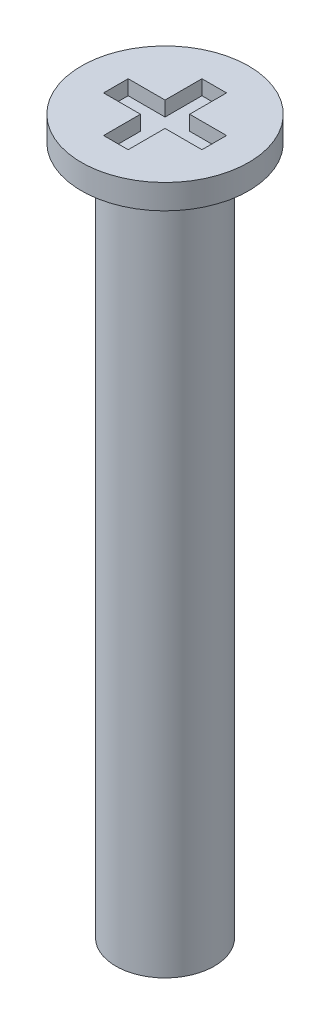
ISO-10303-21;
HEADER;
FILE_DESCRIPTION(('STEP AP214'),'2;1');
FILE_NAME('part.step','',(''),(''),'','','');
FILE_SCHEMA(('AUTOMOTIVE_DESIGN { 1 0 10303 214 1 1 1 1 }'));
ENDSEC;
DATA;
#1=APPLICATION_CONTEXT('core data for automotive mechanical design processes');
#2=APPLICATION_PROTOCOL_DEFINITION('international standard','automotive_design',2000,#1);
#3=PRODUCT_CONTEXT('',#1,'mechanical');
#4=PRODUCT('Part','Part','',(#3));
#5=PRODUCT_RELATED_PRODUCT_CATEGORY('part','',(#4));
#6=PRODUCT_DEFINITION_FORMATION('','',#4);
#7=PRODUCT_DEFINITION_CONTEXT('part definition',#1,'design');
#8=PRODUCT_DEFINITION('design','',#6,#7);
#9=PRODUCT_DEFINITION_SHAPE('','',#8);
#10=(LENGTH_UNIT() NAMED_UNIT(*) SI_UNIT(.MILLI.,.METRE.));
#11=(NAMED_UNIT(*) PLANE_ANGLE_UNIT() SI_UNIT($,.RADIAN.));
#12=(NAMED_UNIT(*) SI_UNIT($,.STERADIAN.) SOLID_ANGLE_UNIT());
#13=UNCERTAINTY_MEASURE_WITH_UNIT(LENGTH_MEASURE(1.E-05),#10,'distance_accuracy_value','');
#14=(GEOMETRIC_REPRESENTATION_CONTEXT(3) GLOBAL_UNCERTAINTY_ASSIGNED_CONTEXT((#13)) GLOBAL_UNIT_ASSIGNED_CONTEXT((#10,
#11,#12)) REPRESENTATION_CONTEXT('',''));
#15=CARTESIAN_POINT('',(0.,0.,0.));
#16=DIRECTION('',(0.,0.,1.));
#17=DIRECTION('',(1.,0.,0.));
#18=AXIS2_PLACEMENT_3D('',#15,#16,#17);
#19=CARTESIAN_POINT('',(0.,0.,0.));
#20=DIRECTION('',(0.,1.,0.));
#21=DIRECTION('',(0.,0.,1.));
#22=AXIS2_PLACEMENT_3D('',#19,#20,#21);
#23=PLANE('',#22);
#24=DIRECTION('',(-1.,0.,0.));
#25=VECTOR('',#24,1.);
#26=CARTESIAN_POINT('',(0.,0.,-0.25));
#27=LINE('',#26,#25);
#28=CARTESIAN_POINT('',(1.,0.,-0.249999999999997));
#29=VERTEX_POINT('',#28);
#30=CARTESIAN_POINT('',(0.25,0.,-0.249999999999999));
#31=VERTEX_POINT('',#30);
#32=EDGE_CURVE('E190',#29,#31,#27,.T.);
#33=ORIENTED_EDGE('',*,*,#32,.F.);
#34=DIRECTION('',(0.,0.,-1.));
#35=VECTOR('',#34,1.);
#36=CARTESIAN_POINT('',(1.,0.,-0.249999999999997));
#37=LINE('',#36,#35);
#38=CARTESIAN_POINT('',(0.999999999999999,0.,0.250000000000003));
#39=VERTEX_POINT('',#38);
#40=EDGE_CURVE('E136',#39,#29,#37,.T.);
#41=ORIENTED_EDGE('',*,*,#40,.F.);
#42=DIRECTION('',(1.,0.,0.));
#43=VECTOR('',#42,1.);
#44=CARTESIAN_POINT('',(0.,0.,0.25));
#45=LINE('',#44,#43);
#46=CARTESIAN_POINT('',(0.25,0.,0.250000000000003));
#47=VERTEX_POINT('',#46);
#48=EDGE_CURVE('E192',#47,#39,#45,.T.);
#49=ORIENTED_EDGE('',*,*,#48,.F.);
#50=DIRECTION('',(0.,0.,-1.));
#51=VECTOR('',#50,1.);
#52=CARTESIAN_POINT('',(0.25,0.,0.));
#53=LINE('',#52,#51);
#54=CARTESIAN_POINT('',(0.25,0.,1.));
#55=VERTEX_POINT('',#54);
#56=EDGE_CURVE('E162',#55,#47,#53,.T.);
#57=ORIENTED_EDGE('',*,*,#56,.F.);
#58=DIRECTION('',(1.,0.,0.));
#59=VECTOR('',#58,1.);
#60=CARTESIAN_POINT('',(0.25,0.,1.));
#61=LINE('',#60,#59);
#62=CARTESIAN_POINT('',(-0.25,0.,1.));
#63=VERTEX_POINT('',#62);
#64=EDGE_CURVE('E166',#63,#55,#61,.T.);
#65=ORIENTED_EDGE('',*,*,#64,.F.);
#66=DIRECTION('',(0.,0.,1.));
#67=VECTOR('',#66,1.);
#68=CARTESIAN_POINT('',(-0.25,0.,0.));
#69=LINE('',#68,#67);
#70=CARTESIAN_POINT('',(-0.25,0.,0.249999999999998));
#71=VERTEX_POINT('',#70);
#72=EDGE_CURVE('E174',#71,#63,#69,.T.);
#73=ORIENTED_EDGE('',*,*,#72,.F.);
#74=DIRECTION('',(1.,0.,0.));
#75=VECTOR('',#74,1.);
#76=CARTESIAN_POINT('',(0.,0.,0.25));
#77=LINE('',#76,#75);
#78=CARTESIAN_POINT('',(-1.,0.,0.24999999999999));
#79=VERTEX_POINT('',#78);
#80=EDGE_CURVE('E155',#79,#71,#77,.T.);
#81=ORIENTED_EDGE('',*,*,#80,.F.);
#82=DIRECTION('',(0.,0.,1.));
#83=VECTOR('',#82,1.);
#84=CARTESIAN_POINT('',(-1.,0.,0.24999999999999));
#85=LINE('',#84,#83);
#86=CARTESIAN_POINT('',(-0.999999999999997,0.,-0.25000000000001));
#87=VERTEX_POINT('',#86);
#88=EDGE_CURVE('E152',#87,#79,#85,.T.);
#89=ORIENTED_EDGE('',*,*,#88,.F.);
#90=CARTESIAN_POINT('',(-0.25,0.,-0.250000000000001));
#91=VERTEX_POINT('',#90);
#92=EDGE_CURVE('E142',#91,#87,#27,.T.);
#93=ORIENTED_EDGE('',*,*,#92,.F.);
#94=DIRECTION('',(0.,0.,1.));
#95=VECTOR('',#94,1.);
#96=CARTESIAN_POINT('',(-0.25,0.,0.));
#97=LINE('',#96,#95);
#98=CARTESIAN_POINT('',(-0.25,0.,-1.));
#99=VERTEX_POINT('',#98);
#100=EDGE_CURVE('E204',#99,#91,#97,.T.);
#101=ORIENTED_EDGE('',*,*,#100,.F.);
#102=DIRECTION('',(-1.,0.,0.));
#103=VECTOR('',#102,1.);
#104=CARTESIAN_POINT('',(-0.25,0.,-1.));
#105=LINE('',#104,#103);
#106=CARTESIAN_POINT('',(0.25,0.,-1.));
#107=VERTEX_POINT('',#106);
#108=EDGE_CURVE('E207',#107,#99,#105,.T.);
#109=ORIENTED_EDGE('',*,*,#108,.F.);
#110=DIRECTION('',(0.,0.,-1.));
#111=VECTOR('',#110,1.);
#112=CARTESIAN_POINT('',(0.25,0.,0.));
#113=LINE('',#112,#111);
#114=EDGE_CURVE('E62',#31,#107,#113,.T.);
#115=ORIENTED_EDGE('',*,*,#114,.F.);
#116=EDGE_LOOP('',(#33,#41,#49,#57,#65,#73,#81,#89,#93,#101,#109,#115));
#117=FACE_BOUND('',#116,.T.);
#118=CARTESIAN_POINT('',(0.,0.,0.));
#119=DIRECTION('',(0.,-1.,0.));
#120=DIRECTION('',(0.,0.,-1.));
#121=AXIS2_PLACEMENT_3D('',#118,#119,#120);
#122=CIRCLE('',#121,1.7);
#123=CARTESIAN_POINT('',(0.,0.,-1.7));
#124=VERTEX_POINT('',#123);
#125=EDGE_CURVE('E11',#124,#124,#122,.T.);
#126=ORIENTED_EDGE('',*,*,#125,.F.);
#127=EDGE_LOOP('',(#126));
#128=FACE_BOUND('',#127,.T.);
#129=ADVANCED_FACE('F34',(#117,#128),#23,.T.);
#130=CARTESIAN_POINT('',(0.,-14.5,0.));
#131=DIRECTION('',(0.,-1.,0.));
#132=DIRECTION('',(0.,0.,-1.));
#133=AXIS2_PLACEMENT_3D('',#130,#131,#132);
#134=CYLINDRICAL_SURFACE('',#133,1.7);
#135=ORIENTED_EDGE('',*,*,#125,.T.);
#136=EDGE_LOOP('',(#135));
#137=FACE_BOUND('',#136,.T.);
#138=CARTESIAN_POINT('',(0.,-0.5,0.));
#139=DIRECTION('',(0.,-1.,0.));
#140=DIRECTION('',(0.,0.,-1.));
#141=AXIS2_PLACEMENT_3D('',#138,#139,#140);
#142=CIRCLE('',#141,1.7);
#143=CARTESIAN_POINT('',(0.,-0.5,-1.7));
#144=VERTEX_POINT('',#143);
#145=EDGE_CURVE('E42',#144,#144,#142,.T.);
#146=ORIENTED_EDGE('',*,*,#145,.F.);
#147=EDGE_LOOP('',(#146));
#148=FACE_BOUND('',#147,.T.);
#149=ADVANCED_FACE('F229',(#137,#148),#134,.T.);
#150=CARTESIAN_POINT('',(1.7,-0.5,0.));
#151=DIRECTION('',(0.,-1.,0.));
#152=DIRECTION('',(0.,0.,-1.));
#153=AXIS2_PLACEMENT_3D('',#150,#151,#152);
#154=PLANE('',#153);
#155=ORIENTED_EDGE('',*,*,#145,.T.);
#156=EDGE_LOOP('',(#155));
#157=FACE_BOUND('',#156,.T.);
#158=CARTESIAN_POINT('',(0.,-0.5,0.));
#159=DIRECTION('',(0.,-1.,0.));
#160=DIRECTION('',(0.,0.,-1.));
#161=AXIS2_PLACEMENT_3D('',#158,#159,#160);
#162=CIRCLE('',#161,1.);
#163=CARTESIAN_POINT('',(0.,-0.5,-1.));
#164=VERTEX_POINT('',#163);
#165=EDGE_CURVE('E221',#164,#164,#162,.T.);
#166=ORIENTED_EDGE('',*,*,#165,.F.);
#167=EDGE_LOOP('',(#166));
#168=FACE_BOUND('',#167,.T.);
#169=ADVANCED_FACE('F226',(#157,#168),#154,.T.);
#170=CARTESIAN_POINT('',(0.,-14.5,0.));
#171=DIRECTION('',(0.,-1.,0.));
#172=DIRECTION('',(0.,0.,-1.));
#173=AXIS2_PLACEMENT_3D('',#170,#171,#172);
#174=CYLINDRICAL_SURFACE('',#173,1.);
#175=ORIENTED_EDGE('',*,*,#165,.T.);
#176=EDGE_LOOP('',(#175));
#177=FACE_BOUND('',#176,.T.);
#178=CARTESIAN_POINT('',(0.,-14.5,0.));
#179=DIRECTION('',(0.,-1.,0.));
#180=DIRECTION('',(0.,0.,-1.));
#181=AXIS2_PLACEMENT_3D('',#178,#179,#180);
#182=CIRCLE('',#181,1.);
#183=CARTESIAN_POINT('',(0.,-14.5,-1.));
#184=VERTEX_POINT('',#183);
#185=EDGE_CURVE('E217',#184,#184,#182,.T.);
#186=ORIENTED_EDGE('',*,*,#185,.F.);
#187=EDGE_LOOP('',(#186));
#188=FACE_BOUND('',#187,.T.);
#189=ADVANCED_FACE('F236',(#177,#188),#174,.T.);
#190=CARTESIAN_POINT('',(1.,-14.5,0.));
#191=DIRECTION('',(0.,-1.,0.));
#192=DIRECTION('',(0.,0.,-1.));
#193=AXIS2_PLACEMENT_3D('',#190,#191,#192);
#194=PLANE('',#193);
#195=ORIENTED_EDGE('',*,*,#185,.T.);
#196=EDGE_LOOP('',(#195));
#197=FACE_BOUND('',#196,.T.);
#198=ADVANCED_FACE('F242',(#197),#194,.T.);
#199=CARTESIAN_POINT('',(-0.25,-0.3,0.));
#200=DIRECTION('',(-1.,0.,0.));
#201=DIRECTION('',(0.,-1.,0.));
#202=AXIS2_PLACEMENT_3D('',#199,#200,#201);
#203=PLANE('',#202);
#204=ORIENTED_EDGE('',*,*,#100,.T.);
#205=DIRECTION('',(0.,-1.,0.));
#206=VECTOR('',#205,1.);
#207=CARTESIAN_POINT('',(-0.25,-0.3,-0.250000000000001));
#208=LINE('',#207,#206);
#209=CARTESIAN_POINT('',(-0.25,-0.3,-0.250000000000001));
#210=VERTEX_POINT('',#209);
#211=EDGE_CURVE('E202',#91,#210,#208,.T.);
#212=ORIENTED_EDGE('',*,*,#211,.T.);
#213=DIRECTION('',(0.,0.,1.));
#214=VECTOR('',#213,1.);
#215=CARTESIAN_POINT('',(-0.25,-0.3,0.));
#216=LINE('',#215,#214);
#217=CARTESIAN_POINT('',(-0.25,-0.3,-1.));
#218=VERTEX_POINT('',#217);
#219=EDGE_CURVE('E134',#218,#210,#216,.T.);
#220=ORIENTED_EDGE('',*,*,#219,.F.);
#221=DIRECTION('',(0.,1.,0.));
#222=VECTOR('',#221,1.);
#223=CARTESIAN_POINT('',(-0.25,-0.3,-1.));
#224=LINE('',#223,#222);
#225=EDGE_CURVE('E50',#218,#99,#224,.T.);
#226=ORIENTED_EDGE('',*,*,#225,.T.);
#227=EDGE_LOOP('',(#204,#212,#220,#226));
#228=FACE_BOUND('',#227,.T.);
#229=ADVANCED_FACE('F246',(#228),#203,.F.);
#230=CARTESIAN_POINT('',(-0.25,-0.3,-1.));
#231=DIRECTION('',(0.,0.,-1.));
#232=DIRECTION('',(-1.,0.,0.));
#233=AXIS2_PLACEMENT_3D('',#230,#231,#232);
#234=PLANE('',#233);
#235=ORIENTED_EDGE('',*,*,#108,.T.);
#236=ORIENTED_EDGE('',*,*,#225,.F.);
#237=DIRECTION('',(-1.,0.,0.));
#238=VECTOR('',#237,1.);
#239=CARTESIAN_POINT('',(-0.25,-0.3,-1.));
#240=LINE('',#239,#238);
#241=CARTESIAN_POINT('',(0.25,-0.3,-1.));
#242=VERTEX_POINT('',#241);
#243=EDGE_CURVE('E209',#242,#218,#240,.T.);
#244=ORIENTED_EDGE('',*,*,#243,.F.);
#245=DIRECTION('',(0.,1.,0.));
#246=VECTOR('',#245,1.);
#247=CARTESIAN_POINT('',(0.25,-0.3,-1.));
#248=LINE('',#247,#246);
#249=EDGE_CURVE('E211',#242,#107,#248,.T.);
#250=ORIENTED_EDGE('',*,*,#249,.T.);
#251=EDGE_LOOP('',(#235,#236,#244,#250));
#252=FACE_BOUND('',#251,.T.);
#253=ADVANCED_FACE('F250',(#252),#234,.F.);
#254=CARTESIAN_POINT('',(0.25,-0.3,0.));
#255=DIRECTION('',(1.,0.,0.));
#256=DIRECTION('',(0.,1.,0.));
#257=AXIS2_PLACEMENT_3D('',#254,#255,#256);
#258=PLANE('',#257);
#259=DIRECTION('',(0.,0.,-1.));
#260=VECTOR('',#259,1.);
#261=CARTESIAN_POINT('',(0.25,-0.3,0.));
#262=LINE('',#261,#260);
#263=CARTESIAN_POINT('',(0.25,-0.3,-0.249999999999999));
#264=VERTEX_POINT('',#263);
#265=EDGE_CURVE('E206',#264,#242,#262,.T.);
#266=ORIENTED_EDGE('',*,*,#265,.F.);
#267=DIRECTION('',(0.,1.,0.));
#268=VECTOR('',#267,1.);
#269=CARTESIAN_POINT('',(0.25,-0.3,-0.249999999999999));
#270=LINE('',#269,#268);
#271=EDGE_CURVE('E198',#264,#31,#270,.T.);
#272=ORIENTED_EDGE('',*,*,#271,.T.);
#273=ORIENTED_EDGE('',*,*,#114,.T.);
#274=ORIENTED_EDGE('',*,*,#249,.F.);
#275=EDGE_LOOP('',(#266,#272,#273,#274));
#276=FACE_BOUND('',#275,.T.);
#277=ADVANCED_FACE('F252',(#276),#258,.F.);
#278=CARTESIAN_POINT('',(0.,-0.3,0.));
#279=DIRECTION('',(0.,-1.,0.));
#280=DIRECTION('',(1.,0.,0.));
#281=AXIS2_PLACEMENT_3D('',#278,#279,#280);
#282=PLANE('',#281);
#283=DIRECTION('',(-1.,0.,0.));
#284=VECTOR('',#283,1.);
#285=CARTESIAN_POINT('',(0.,-0.3,-0.25));
#286=LINE('',#285,#284);
#287=CARTESIAN_POINT('',(1.,-0.3,-0.249999999999997));
#288=VERTEX_POINT('',#287);
#289=EDGE_CURVE('E135',#288,#264,#286,.T.);
#290=ORIENTED_EDGE('',*,*,#289,.T.);
#291=ORIENTED_EDGE('',*,*,#265,.T.);
#292=ORIENTED_EDGE('',*,*,#243,.T.);
#293=ORIENTED_EDGE('',*,*,#219,.T.);
#294=CARTESIAN_POINT('',(-0.999999999999997,-0.3,-0.25000000000001));
#295=VERTEX_POINT('',#294);
#296=EDGE_CURVE('E70',#210,#295,#286,.T.);
#297=ORIENTED_EDGE('',*,*,#296,.T.);
#298=DIRECTION('',(0.,0.,1.));
#299=VECTOR('',#298,1.);
#300=CARTESIAN_POINT('',(-1.,-0.3,0.24999999999999));
#301=LINE('',#300,#299);
#302=CARTESIAN_POINT('',(-1.,-0.3,0.24999999999999));
#303=VERTEX_POINT('',#302);
#304=EDGE_CURVE('E132',#295,#303,#301,.T.);
#305=ORIENTED_EDGE('',*,*,#304,.T.);
#306=DIRECTION('',(1.,0.,0.));
#307=VECTOR('',#306,1.);
#308=CARTESIAN_POINT('',(0.,-0.3,0.25));
#309=LINE('',#308,#307);
#310=CARTESIAN_POINT('',(-0.25,-0.3,0.249999999999998));
#311=VERTEX_POINT('',#310);
#312=EDGE_CURVE('E150',#303,#311,#309,.T.);
#313=ORIENTED_EDGE('',*,*,#312,.T.);
#314=DIRECTION('',(0.,0.,1.));
#315=VECTOR('',#314,1.);
#316=CARTESIAN_POINT('',(-0.25,-0.3,0.));
#317=LINE('',#316,#315);
#318=CARTESIAN_POINT('',(-0.25,-0.3,1.));
#319=VERTEX_POINT('',#318);
#320=EDGE_CURVE('E165',#311,#319,#317,.T.);
#321=ORIENTED_EDGE('',*,*,#320,.T.);
#322=DIRECTION('',(1.,0.,0.));
#323=VECTOR('',#322,1.);
#324=CARTESIAN_POINT('',(0.25,-0.3,1.));
#325=LINE('',#324,#323);
#326=CARTESIAN_POINT('',(0.25,-0.3,1.));
#327=VERTEX_POINT('',#326);
#328=EDGE_CURVE('E168',#319,#327,#325,.T.);
#329=ORIENTED_EDGE('',*,*,#328,.T.);
#330=DIRECTION('',(0.,0.,-1.));
#331=VECTOR('',#330,1.);
#332=CARTESIAN_POINT('',(0.25,-0.3,0.));
#333=LINE('',#332,#331);
#334=CARTESIAN_POINT('',(0.25,-0.3,0.250000000000003));
#335=VERTEX_POINT('',#334);
#336=EDGE_CURVE('E163',#327,#335,#333,.T.);
#337=ORIENTED_EDGE('',*,*,#336,.T.);
#338=DIRECTION('',(1.,0.,0.));
#339=VECTOR('',#338,1.);
#340=CARTESIAN_POINT('',(0.,-0.3,0.25));
#341=LINE('',#340,#339);
#342=CARTESIAN_POINT('',(0.999999999999999,-0.3,0.250000000000003));
#343=VERTEX_POINT('',#342);
#344=EDGE_CURVE('E184',#335,#343,#341,.T.);
#345=ORIENTED_EDGE('',*,*,#344,.T.);
#346=DIRECTION('',(0.,0.,-1.));
#347=VECTOR('',#346,1.);
#348=CARTESIAN_POINT('',(1.,-0.3,-0.249999999999997));
#349=LINE('',#348,#347);
#350=EDGE_CURVE('E186',#343,#288,#349,.T.);
#351=ORIENTED_EDGE('',*,*,#350,.T.);
#352=EDGE_LOOP('',(#290,#291,#292,#293,#297,#305,#313,#321,#329,#337,#345,#351));
#353=FACE_BOUND('',#352,.T.);
#354=ADVANCED_FACE('F130',(#353),#282,.F.);
#355=CARTESIAN_POINT('',(0.,-0.3,-0.25));
#356=DIRECTION('',(0.,0.,-1.));
#357=DIRECTION('',(-1.,0.,0.));
#358=AXIS2_PLACEMENT_3D('',#355,#356,#357);
#359=PLANE('',#358);
#360=ORIENTED_EDGE('',*,*,#92,.T.);
#361=DIRECTION('',(0.,1.,0.));
#362=VECTOR('',#361,1.);
#363=CARTESIAN_POINT('',(-0.999999999999997,-0.3,-0.25000000000001));
#364=LINE('',#363,#362);
#365=EDGE_CURVE('E139',#295,#87,#364,.T.);
#366=ORIENTED_EDGE('',*,*,#365,.F.);
#367=ORIENTED_EDGE('',*,*,#296,.F.);
#368=ORIENTED_EDGE('',*,*,#211,.F.);
#369=EDGE_LOOP('',(#360,#366,#367,#368));
#370=FACE_BOUND('',#369,.T.);
#371=ADVANCED_FACE('F140',(#370),#359,.F.);
#372=ORIENTED_EDGE('',*,*,#289,.F.);
#373=DIRECTION('',(0.,1.,0.));
#374=VECTOR('',#373,1.);
#375=CARTESIAN_POINT('',(1.,-0.3,-0.249999999999997));
#376=LINE('',#375,#374);
#377=EDGE_CURVE('E196',#288,#29,#376,.T.);
#378=ORIENTED_EDGE('',*,*,#377,.T.);
#379=ORIENTED_EDGE('',*,*,#32,.T.);
#380=ORIENTED_EDGE('',*,*,#271,.F.);
#381=EDGE_LOOP('',(#372,#378,#379,#380));
#382=FACE_BOUND('',#381,.T.);
#383=ADVANCED_FACE('F261',(#382),#359,.F.);
#384=CARTESIAN_POINT('',(1.,-0.3,-0.249999999999997));
#385=DIRECTION('',(1.,0.,0.));
#386=DIRECTION('',(0.,0.,-1.));
#387=AXIS2_PLACEMENT_3D('',#384,#385,#386);
#388=PLANE('',#387);
#389=ORIENTED_EDGE('',*,*,#40,.T.);
#390=ORIENTED_EDGE('',*,*,#377,.F.);
#391=ORIENTED_EDGE('',*,*,#350,.F.);
#392=DIRECTION('',(0.,1.,0.));
#393=VECTOR('',#392,1.);
#394=CARTESIAN_POINT('',(0.999999999999999,-0.3,0.250000000000003));
#395=LINE('',#394,#393);
#396=EDGE_CURVE('E189',#343,#39,#395,.T.);
#397=ORIENTED_EDGE('',*,*,#396,.T.);
#398=EDGE_LOOP('',(#389,#390,#391,#397));
#399=FACE_BOUND('',#398,.T.);
#400=ADVANCED_FACE('F266',(#399),#388,.F.);
#401=CARTESIAN_POINT('',(0.,-0.3,0.25));
#402=DIRECTION('',(0.,0.,1.));
#403=DIRECTION('',(1.,0.,0.));
#404=AXIS2_PLACEMENT_3D('',#401,#402,#403);
#405=PLANE('',#404);
#406=DIRECTION('',(0.,1.,0.));
#407=VECTOR('',#406,1.);
#408=CARTESIAN_POINT('',(0.25,-0.3,0.250000000000001));
#409=LINE('',#408,#407);
#410=EDGE_CURVE('E180',#335,#47,#409,.T.);
#411=ORIENTED_EDGE('',*,*,#410,.T.);
#412=ORIENTED_EDGE('',*,*,#48,.T.);
#413=ORIENTED_EDGE('',*,*,#396,.F.);
#414=ORIENTED_EDGE('',*,*,#344,.F.);
#415=EDGE_LOOP('',(#411,#412,#413,#414));
#416=FACE_BOUND('',#415,.T.);
#417=ADVANCED_FACE('F262',(#416),#405,.F.);
#418=CARTESIAN_POINT('',(0.25,-0.3,0.));
#419=DIRECTION('',(1.,0.,0.));
#420=DIRECTION('',(0.,1.,0.));
#421=AXIS2_PLACEMENT_3D('',#418,#419,#420);
#422=PLANE('',#421);
#423=ORIENTED_EDGE('',*,*,#336,.F.);
#424=DIRECTION('',(0.,1.,0.));
#425=VECTOR('',#424,1.);
#426=CARTESIAN_POINT('',(0.25,-0.3,1.));
#427=LINE('',#426,#425);
#428=EDGE_CURVE('E178',#327,#55,#427,.T.);
#429=ORIENTED_EDGE('',*,*,#428,.T.);
#430=ORIENTED_EDGE('',*,*,#56,.T.);
#431=ORIENTED_EDGE('',*,*,#410,.F.);
#432=EDGE_LOOP('',(#423,#429,#430,#431));
#433=FACE_BOUND('',#432,.T.);
#434=ADVANCED_FACE('F265',(#433),#422,.F.);
#435=CARTESIAN_POINT('',(0.25,-0.3,1.));
#436=DIRECTION('',(0.,0.,1.));
#437=DIRECTION('',(1.,0.,0.));
#438=AXIS2_PLACEMENT_3D('',#435,#436,#437);
#439=PLANE('',#438);
#440=ORIENTED_EDGE('',*,*,#64,.T.);
#441=ORIENTED_EDGE('',*,*,#428,.F.);
#442=ORIENTED_EDGE('',*,*,#328,.F.);
#443=DIRECTION('',(0.,1.,0.));
#444=VECTOR('',#443,1.);
#445=CARTESIAN_POINT('',(-0.25,-0.3,1.));
#446=LINE('',#445,#444);
#447=EDGE_CURVE('E171',#319,#63,#446,.T.);
#448=ORIENTED_EDGE('',*,*,#447,.T.);
#449=EDGE_LOOP('',(#440,#441,#442,#448));
#450=FACE_BOUND('',#449,.T.);
#451=ADVANCED_FACE('F273',(#450),#439,.F.);
#452=CARTESIAN_POINT('',(-0.25,-0.3,0.));
#453=DIRECTION('',(-1.,0.,0.));
#454=DIRECTION('',(0.,-1.,0.));
#455=AXIS2_PLACEMENT_3D('',#452,#453,#454);
#456=PLANE('',#455);
#457=DIRECTION('',(0.,1.,0.));
#458=VECTOR('',#457,1.);
#459=CARTESIAN_POINT('',(-0.25,-0.3,0.249999999999998));
#460=LINE('',#459,#458);
#461=EDGE_CURVE('E159',#311,#71,#460,.T.);
#462=ORIENTED_EDGE('',*,*,#461,.T.);
#463=ORIENTED_EDGE('',*,*,#72,.T.);
#464=ORIENTED_EDGE('',*,*,#447,.F.);
#465=ORIENTED_EDGE('',*,*,#320,.F.);
#466=EDGE_LOOP('',(#462,#463,#464,#465));
#467=FACE_BOUND('',#466,.T.);
#468=ADVANCED_FACE('F275',(#467),#456,.F.);
#469=CARTESIAN_POINT('',(0.,-0.3,0.25));
#470=DIRECTION('',(0.,0.,1.));
#471=DIRECTION('',(1.,0.,0.));
#472=AXIS2_PLACEMENT_3D('',#469,#470,#471);
#473=PLANE('',#472);
#474=ORIENTED_EDGE('',*,*,#312,.F.);
#475=DIRECTION('',(0.,1.,0.));
#476=VECTOR('',#475,1.);
#477=CARTESIAN_POINT('',(-1.,-0.3,0.24999999999999));
#478=LINE('',#477,#476);
#479=EDGE_CURVE('E146',#303,#79,#478,.T.);
#480=ORIENTED_EDGE('',*,*,#479,.T.);
#481=ORIENTED_EDGE('',*,*,#80,.T.);
#482=ORIENTED_EDGE('',*,*,#461,.F.);
#483=EDGE_LOOP('',(#474,#480,#481,#482));
#484=FACE_BOUND('',#483,.T.);
#485=ADVANCED_FACE('F278',(#484),#473,.F.);
#486=CARTESIAN_POINT('',(-1.,-0.3,0.24999999999999));
#487=DIRECTION('',(-1.,0.,0.));
#488=DIRECTION('',(0.,0.,1.));
#489=AXIS2_PLACEMENT_3D('',#486,#487,#488);
#490=PLANE('',#489);
#491=ORIENTED_EDGE('',*,*,#88,.T.);
#492=ORIENTED_EDGE('',*,*,#479,.F.);
#493=ORIENTED_EDGE('',*,*,#304,.F.);
#494=ORIENTED_EDGE('',*,*,#365,.T.);
#495=EDGE_LOOP('',(#491,#492,#493,#494));
#496=FACE_BOUND('',#495,.T.);
#497=ADVANCED_FACE('F148',(#496),#490,.F.);
#498=CLOSED_SHELL('',(#129,#149,#169,#189,#198,#229,#253,#277,#354,#371,#383,#400,#417,#434,
#451,#468,#485,#497));
#499=MANIFOLD_SOLID_BREP('B2',#498);
#500=ADVANCED_BREP_SHAPE_REPRESENTATION('',(#18,#499),#14);
#501=SHAPE_DEFINITION_REPRESENTATION(#9,#500);
ENDSEC;
END-ISO-10303-21;
